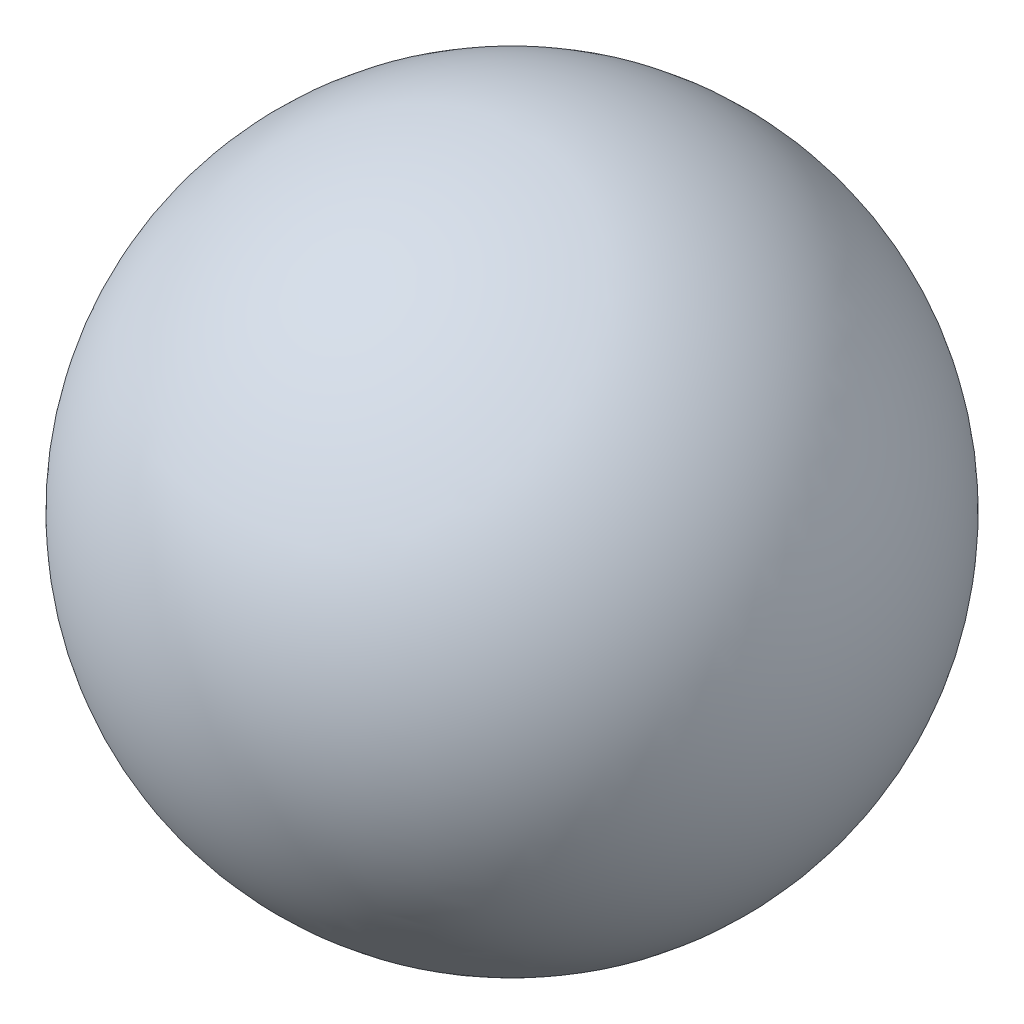
ISO-10303-21;
HEADER;
FILE_DESCRIPTION(('STEP AP214'),'2;1');
FILE_NAME('part.step','',(''),(''),'','','');
FILE_SCHEMA(('AUTOMOTIVE_DESIGN { 1 0 10303 214 1 1 1 1 }'));
ENDSEC;
DATA;
#1=APPLICATION_CONTEXT('core data for automotive mechanical design processes');
#2=APPLICATION_PROTOCOL_DEFINITION('international standard','automotive_design',2000,#1);
#3=PRODUCT_CONTEXT('',#1,'mechanical');
#4=PRODUCT('Part','Part','',(#3));
#5=PRODUCT_RELATED_PRODUCT_CATEGORY('part','',(#4));
#6=PRODUCT_DEFINITION_FORMATION('','',#4);
#7=PRODUCT_DEFINITION_CONTEXT('part definition',#1,'design');
#8=PRODUCT_DEFINITION('design','',#6,#7);
#9=PRODUCT_DEFINITION_SHAPE('','',#8);
#10=(LENGTH_UNIT() NAMED_UNIT(*) SI_UNIT(.MILLI.,.METRE.));
#11=(NAMED_UNIT(*) PLANE_ANGLE_UNIT() SI_UNIT($,.RADIAN.));
#12=(NAMED_UNIT(*) SI_UNIT($,.STERADIAN.) SOLID_ANGLE_UNIT());
#13=UNCERTAINTY_MEASURE_WITH_UNIT(LENGTH_MEASURE(1.E-05),#10,'distance_accuracy_value','');
#14=(GEOMETRIC_REPRESENTATION_CONTEXT(3) GLOBAL_UNCERTAINTY_ASSIGNED_CONTEXT((#13)) GLOBAL_UNIT_ASSIGNED_CONTEXT((#10,
#11,#12)) REPRESENTATION_CONTEXT('',''));
#15=CARTESIAN_POINT('',(0.,0.,0.));
#16=DIRECTION('',(0.,0.,1.));
#17=DIRECTION('',(1.,0.,0.));
#18=AXIS2_PLACEMENT_3D('',#15,#16,#17);
#19=CARTESIAN_POINT('',(0.,15.875,0.));
#20=DIRECTION('',(0.,-1.,0.));
#21=DIRECTION('',(-1.,0.,0.));
#22=AXIS2_PLACEMENT_3D('',#19,#20,#21);
#23=SPHERICAL_SURFACE('',#22,15.875);
#24=CARTESIAN_POINT('',(-5.05609144608058,11.3281173975386,-14.3449441577269));
#25=CARTESIAN_POINT('',(-5.18194597906366,11.4544001902097,-14.3406129652779));
#26=CARTESIAN_POINT('',(-5.30246692651441,11.5859762301908,-14.3365111681256));
#27=CARTESIAN_POINT('',(-5.53205686929649,11.8588531958666,-14.3287942699149));
#28=CARTESIAN_POINT('',(-5.64112286491381,12.0001566529273,-14.3251792962716));
#29=CARTESIAN_POINT('',(-5.84707035635124,12.2915760367517,-14.3184616257363));
#30=CARTESIAN_POINT('',(-5.94394098929644,12.4416996478454,-14.3153593847961));
#31=CARTESIAN_POINT('',(-6.12472983409431,12.749637790646,-14.3096931036741));
#32=CARTESIAN_POINT('',(-6.20864330028307,12.907455112522,-14.3071292605615));
#33=CARTESIAN_POINT('',(-6.36281171488887,13.2294738923995,-14.3025623285926));
#34=CARTESIAN_POINT('',(-6.43307781763968,13.3936700040001,-14.3005587811983));
#35=CARTESIAN_POINT('',(-6.559559571341,13.7274627795001,-14.2971240266457));
#36=CARTESIAN_POINT('',(-6.61577003198006,13.8970614123963,-14.2956930307961));
#37=CARTESIAN_POINT('',(-6.71367520813669,14.2402885252721,-14.293415894662));
#38=CARTESIAN_POINT('',(-6.755378853125,14.4139144558401,-14.2925693942822));
#39=CARTESIAN_POINT('',(-6.8240339851647,14.7641274052765,-14.2914659804999));
#40=CARTESIAN_POINT('',(-6.85098002315446,14.9407154931141,-14.2912092847639));
#41=CARTESIAN_POINT('',(-6.88989260098654,15.2954261973087,-14.2912880266537));
#42=CARTESIAN_POINT('',(-6.90186818016194,15.4735478222075,-14.2916231066635));
#43=CARTESIAN_POINT('',(-6.91078652968876,15.830230829319,-14.2928824231217));
#44=CARTESIAN_POINT('',(-6.90772374903362,16.0087923495955,-14.2938068770119));
#45=CARTESIAN_POINT('',(-6.88657862559004,16.3649604526217,-14.2962377966631));
#46=CARTESIAN_POINT('',(-6.86850125658967,16.5425673320025,-14.2977440696));
#47=CARTESIAN_POINT('',(-6.81745387868286,16.8956888223168,-14.3013279992766));
#48=CARTESIAN_POINT('',(-6.78447837280716,17.0712026364153,-14.3034058668071));
#49=CARTESIAN_POINT('',(-6.70388452571864,17.4187549370323,-14.3081162671129));
#50=CARTESIAN_POINT('',(-6.65627202216413,17.5907947799719,-14.3107485786285));
#51=CARTESIAN_POINT('',(-6.54672280134485,17.9303091970262,-14.3165496260033));
#52=CARTESIAN_POINT('',(-6.48478080394525,18.0977820628088,-14.3197185594815));
#53=CARTESIAN_POINT('',(-6.3470385628776,18.4268583945684,-14.3265677662732));
#54=CARTESIAN_POINT('',(-6.27124345135972,18.5884640076926,-14.3302478501006));
#55=CARTESIAN_POINT('',(-6.10633295628065,18.9047377909158,-14.3380924474841));
#56=CARTESIAN_POINT('',(-6.01721266302965,19.0594033765243,-14.3422571394691));
#57=CARTESIAN_POINT('',(-5.73072794658095,19.5113272789476,-14.3554351601807));
#58=CARTESIAN_POINT('',(-5.51415534120627,19.7967137445211,-14.3651366283408));
#59=CARTESIAN_POINT('',(-5.03634316798354,20.3269130526614,-14.3860695284426));
#60=CARTESIAN_POINT('',(-4.77510350968369,20.5717258130635,-14.3973009634823));
#61=CARTESIAN_POINT('',(-4.2150568301501,21.014240346901,-14.420979462531));
#62=CARTESIAN_POINT('',(-3.91622251473372,21.2119075870827,-14.4334274082613));
#63=CARTESIAN_POINT('',(-3.28964923978126,21.5542515786701,-14.459169385599));
#64=CARTESIAN_POINT('',(-2.96191013617733,21.6989280659395,-14.4724634214235));
#65=CARTESIAN_POINT('',(-2.28658892976296,21.9312936352497,-14.4995246002395));
#66=CARTESIAN_POINT('',(-1.93899384589602,22.0189449617475,-14.5132920503348));
#67=CARTESIAN_POINT('',(-1.2340230358302,22.1346215875128,-14.5408987098011));
#68=CARTESIAN_POINT('',(-0.876647290809662,22.1626467720291,-14.55473791931));
#69=CARTESIAN_POINT('',(-0.162144121146271,22.1582738484134,-14.5821007418742));
#70=CARTESIAN_POINT('',(0.194983195413408,22.125857425318,-14.595624258011));
#71=CARTESIAN_POINT('',(0.898739905600794,22.001475297151,-14.6219715441013));
#72=CARTESIAN_POINT('',(1.24536930056769,21.909509599676,-14.634795314144));
#73=CARTESIAN_POINT('',(1.91821987418496,21.6686474597805,-14.6593833586628));
#74=CARTESIAN_POINT('',(2.2444446982457,21.5197612205874,-14.671147822557));
#75=CARTESIAN_POINT('',(2.86727619897407,21.1692683243804,-14.6932939750194));
#76=CARTESIAN_POINT('',(3.16388295594749,20.9676618103165,-14.703675667337));
#77=CARTESIAN_POINT('',(3.71887390597146,20.5175711187349,-14.7227647874313));
#78=CARTESIAN_POINT('',(3.97727986661055,20.2691138228531,-14.7314731695489));
#79=CARTESIAN_POINT('',(4.44871227257371,19.7322918619407,-14.7469844002659));
#80=CARTESIAN_POINT('',(4.66173889211507,19.4439273501263,-14.7537872561808));
#81=CARTESIAN_POINT('',(5.03620574478133,18.8356976577845,-14.7652975389011));
#82=CARTESIAN_POINT('',(5.19768259837667,18.5158550512683,-14.7700064541608));
#83=CARTESIAN_POINT('',(5.46465563283269,17.8535792443429,-14.7772078008554));
#84=CARTESIAN_POINT('',(5.57015201338522,17.5111461245229,-14.779700240197));
#85=CARTESIAN_POINT('',(5.72211689117394,16.8136122694307,-14.7824001966196));
#86=CARTESIAN_POINT('',(5.76861770536634,16.4585185791463,-14.7826089651421));
#87=CARTESIAN_POINT('',(5.80137598403894,15.7455688358854,-14.7807391308811));
#88=CARTESIAN_POINT('',(5.78763351761972,15.387712786078,-14.7786605307213));
#89=CARTESIAN_POINT('',(5.70031271168909,14.6794570431483,-14.7722730255777));
#90=CARTESIAN_POINT('',(5.62674359289039,14.3290562095389,-14.7679644643212));
#91=CARTESIAN_POINT('',(5.42186835123669,13.6455832941197,-14.7572337099631));
#92=CARTESIAN_POINT('',(5.29056223300197,13.3125112109231,-14.7508115170305));
#93=CARTESIAN_POINT('',(4.97395778912562,12.6730798636121,-14.7360282342204));
#94=CARTESIAN_POINT('',(4.78864314392838,12.3667287100685,-14.7276665584527));
#95=CARTESIAN_POINT('',(4.36911790694922,11.789373690297,-14.7092258009567));
#96=CARTESIAN_POINT('',(4.13490707557275,11.5183699972846,-14.6991467108129));
#97=CARTESIAN_POINT('',(3.75223146156185,11.1443449066917,-14.6829606662696));
#98=CARTESIAN_POINT('',(3.61931989854508,11.0249956088686,-14.67738221489));
#99=CARTESIAN_POINT('',(3.34394393235414,10.7979259151772,-14.6659061113697));
#100=CARTESIAN_POINT('',(3.20148306182735,10.690201256989,-14.6600085774236));
#101=CARTESIAN_POINT('',(2.90795834787436,10.4871069894318,-14.6479325778771));
#102=CARTESIAN_POINT('',(2.75689131083293,10.391742010109,-14.6417540081624));
#103=CARTESIAN_POINT('',(2.44732419343868,10.2141084406913,-14.629162817621));
#104=CARTESIAN_POINT('',(2.28882686951082,10.131835042992,-14.6227502837811));
#105=CARTESIAN_POINT('',(1.96529937179515,9.9808457465741,-14.6097267162749));
#106=CARTESIAN_POINT('',(1.80026228406668,9.91214468208717,-14.6031154744159));
#107=CARTESIAN_POINT('',(1.46505212081581,9.78892040828339,-14.5897499106196));
#108=CARTESIAN_POINT('',(1.29488095855382,9.73439198849012,-14.5829956422555));
#109=CARTESIAN_POINT('',(0.950496178624236,9.63985044657577,-14.5693868711755));
#110=CARTESIAN_POINT('',(0.7762812369173,9.59984215214013,-14.5625323359093));
#111=CARTESIAN_POINT('',(0.425166241837441,9.53466175167858,-14.5487761577102));
#112=CARTESIAN_POINT('',(0.248267202135577,9.50948418105364,-14.5418745330775));
#113=CARTESIAN_POINT('',(-0.107152582581009,9.47410787557505,-14.5280655236956));
#114=CARTESIAN_POINT('',(-0.285674414756083,9.46392006209792,-14.5211581384118));
#115=CARTESIAN_POINT('',(-0.642877310779398,9.45863164205451,-14.5073943904002));
#116=CARTESIAN_POINT('',(-0.821558291666802,9.4635254750538,-14.5005380098019));
#117=CARTESIAN_POINT('',(-1.17798635744462,9.48836190638993,-14.4869184952206));
#118=CARTESIAN_POINT('',(-1.35573279597222,9.50831381566217,-14.4801554215683));
#119=CARTESIAN_POINT('',(-1.70885012945015,9.56312638019765,-14.4667779703063));
#120=CARTESIAN_POINT('',(-1.88422187652277,9.59798153308688,-14.4601635387647));
#121=CARTESIAN_POINT('',(-2.23156022863916,9.68239018873905,-14.4471228833497));
#122=CARTESIAN_POINT('',(-2.40352375655747,9.73195638131111,-14.4406968272499));
#123=CARTESIAN_POINT('',(-2.74260059813034,9.84540334584686,-14.4280879223872));
#124=CARTESIAN_POINT('',(-2.90971566421585,9.90927887115975,-14.4219049854567));
#125=CARTESIAN_POINT('',(-3.23782707230488,10.0508413680475,-14.4098301957548));
#126=CARTESIAN_POINT('',(-3.39882873533292,10.1285159783429,-14.403938088444));
#127=CARTESIAN_POINT('',(-3.71367183425565,10.2971337912931,-14.3924840418858));
#128=CARTESIAN_POINT('',(-3.86751514284908,10.3880734976274,-14.3869220161797));
#129=CARTESIAN_POINT('',(-4.20455531367652,10.6069989437153,-14.3748183209182));
#130=CARTESIAN_POINT('',(-4.38544928945976,10.7385578247294,-14.368380354107));
#131=CARTESIAN_POINT('',(-4.73238296366912,11.0200144015421,-14.3561563009231));
#132=CARTESIAN_POINT('',(-4.89842266275875,11.1699120965216,-14.3503702145212));
#133=CARTESIAN_POINT('',(-5.05609144608058,11.3281173975386,-14.3449441577269));
#134=B_SPLINE_CURVE_WITH_KNOTS('',3,(#24,#25,#26,#27,#28,#29,#30,#31,#32,#33,#34,#35,#36,#37,
#38,#39,#40,#41,#42,#43,#44,#45,#46,#47,#48,#49,#50,#51,#52,#53,#54,#55,#56,#57,#58,#59,#60,#61,
#62,#63,#64,#65,#66,#67,#68,#69,#70,#71,#72,#73,#74,#75,#76,#77,#78,#79,#80,#81,#82,#83,#84,#85,
#86,#87,#88,#89,#90,#91,#92,#93,#94,#95,#96,#97,#98,#99,#100,#101,#102,#103,#104,#105,#106,#107,
#108,#109,#110,#111,#112,#113,#114,#115,#116,#117,#118,#119,#120,#121,#122,#123,#124,#125,#126,
#127,#128,#129,#130,#131,#132,#133),.UNSPECIFIED.,.T.,.F.,(4,2,2,2,2,2,2,2,2,2,2,2,2,2,2,2,2,2,
2,2,2,2,2,2,2,2,2,2,2,2,2,2,2,2,2,2,2,2,2,2,2,2,2,2,2,2,2,2,2,2,2,2,2,2,4),(0.,
0.534827687941287,1.06979508409236,1.60523567438448,2.14087191118887,2.67606849951549,
3.211462428408,3.74652621734661,4.28178743892129,4.81672530733552,5.35186064853466,
5.88681878949028,6.42197447548701,6.95691700220069,7.49205695950482,8.02699906438904,
8.56213875769122,9.63177231049515,10.701408029357,11.7718248475694,12.8422470012768,
13.9133771468821,14.984509353887,16.0559661871921,17.1274228838136,18.1986876076596,
19.2699494268227,20.3405984467014,21.4112433561427,22.4811259882067,23.5510048037924,
24.6202973011411,25.6895885719843,26.7587150707905,27.8278414840421,28.8972912867793,
29.966746330014,30.5023860520721,31.0378287029604,31.5734713592274,32.1089168559061,
32.6449443825662,33.1807745627089,33.7167827340734,34.2525932815753,34.7887940219217,
35.3247970947043,35.8611318687553,36.397268795291,36.9338695467808,37.4702738696754,
38.0062000802313,38.5419852895266,39.212009901374,39.8820344832925),.UNSPECIFIED.);
#135=CARTESIAN_POINT('',(-5.05609144608058,11.3281173975386,-14.3449441577269));
#136=VERTEX_POINT('',#135);
#137=EDGE_CURVE('E10',#136,#136,#134,.T.);
#138=ORIENTED_EDGE('',*,*,#137,.F.);
#139=EDGE_LOOP('',(#138));
#140=FACE_BOUND('',#139,.T.);
#141=ADVANCED_FACE('F33',(#140),#23,.T.);
#142=CARTESIAN_POINT('',(-0.558310545477246,15.8105795524449,-20.828));
#143=DIRECTION('',(0.,0.,1.));
#144=DIRECTION('',(1.,0.,0.));
#145=AXIS2_PLACEMENT_3D('',#142,#143,#144);
#146=CYLINDRICAL_SURFACE('',#145,6.35);
#147=ORIENTED_EDGE('',*,*,#137,.T.);
#148=EDGE_LOOP('',(#147));
#149=FACE_BOUND('',#148,.T.);
#150=CARTESIAN_POINT('',(-0.558310545477246,15.8105795524449,0.));
#151=DIRECTION('',(0.,0.,1.));
#152=DIRECTION('',(1.,0.,0.));
#153=AXIS2_PLACEMENT_3D('',#150,#151,#152);
#154=CIRCLE('',#153,6.35);
#155=CARTESIAN_POINT('',(5.79168945452275,15.8105795524449,0.));
#156=VERTEX_POINT('',#155);
#157=EDGE_CURVE('E42',#156,#156,#154,.T.);
#158=ORIENTED_EDGE('',*,*,#157,.T.);
#159=EDGE_LOOP('',(#158));
#160=FACE_BOUND('',#159,.T.);
#161=ADVANCED_FACE('F48',(#149,#160),#146,.F.);
#162=CARTESIAN_POINT('',(-0.558310545477246,15.8105795524449,0.));
#163=DIRECTION('',(0.,0.,1.));
#164=DIRECTION('',(1.,0.,0.));
#165=AXIS2_PLACEMENT_3D('',#162,#163,#164);
#166=PLANE('',#165);
#167=ORIENTED_EDGE('',*,*,#157,.F.);
#168=EDGE_LOOP('',(#167));
#169=FACE_BOUND('',#168,.T.);
#170=ADVANCED_FACE('F50',(#169),#166,.F.);
#171=CLOSED_SHELL('',(#141,#161,#170));
#172=MANIFOLD_SOLID_BREP('B2',#171);
#173=ADVANCED_BREP_SHAPE_REPRESENTATION('',(#18,#172),#14);
#174=SHAPE_DEFINITION_REPRESENTATION(#9,#173);
ENDSEC;
END-ISO-10303-21;
